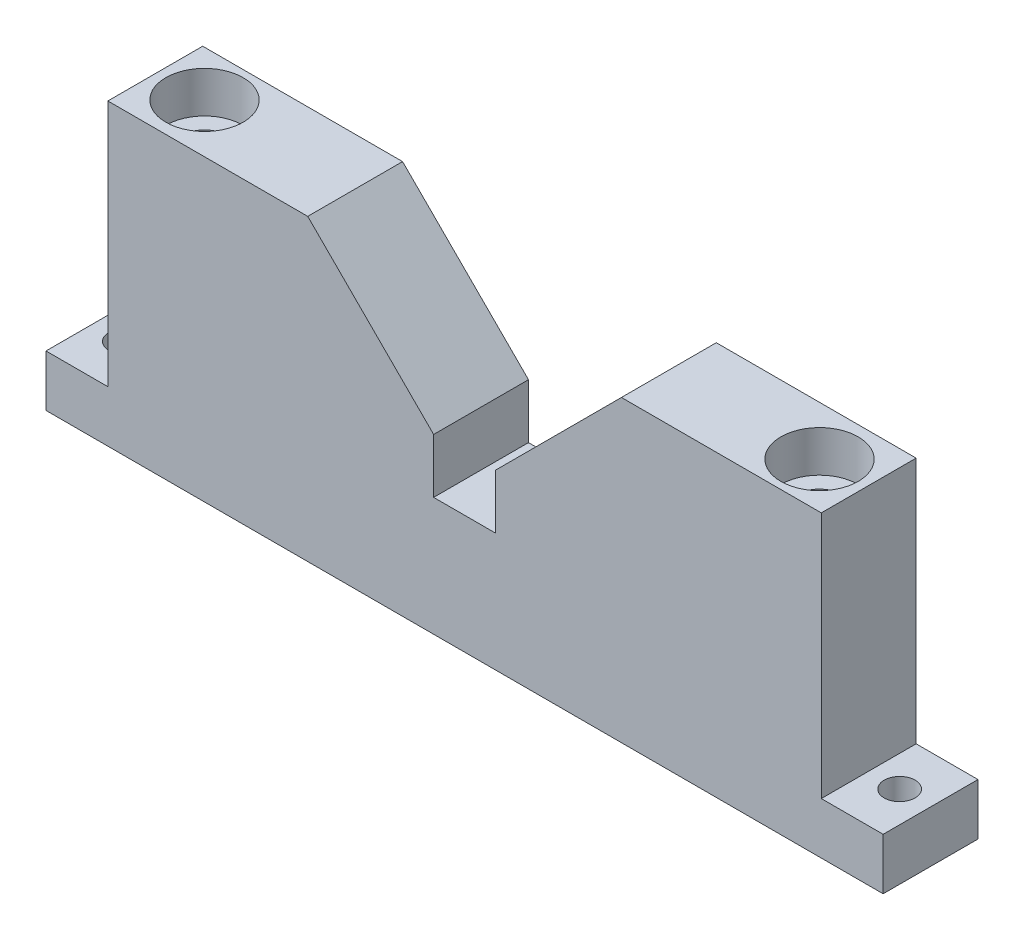
ISO-10303-21;
HEADER;
FILE_DESCRIPTION(('STEP AP214'),'2;1');
FILE_NAME('part.step','',(''),(''),'','','');
FILE_SCHEMA(('AUTOMOTIVE_DESIGN { 1 0 10303 214 1 1 1 1 }'));
ENDSEC;
DATA;
#1=APPLICATION_CONTEXT('core data for automotive mechanical design processes');
#2=APPLICATION_PROTOCOL_DEFINITION('international standard','automotive_design',2000,#1);
#3=PRODUCT_CONTEXT('',#1,'mechanical');
#4=PRODUCT('Part','Part','',(#3));
#5=PRODUCT_RELATED_PRODUCT_CATEGORY('part','',(#4));
#6=PRODUCT_DEFINITION_FORMATION('','',#4);
#7=PRODUCT_DEFINITION_CONTEXT('part definition',#1,'design');
#8=PRODUCT_DEFINITION('design','',#6,#7);
#9=PRODUCT_DEFINITION_SHAPE('','',#8);
#10=(LENGTH_UNIT() NAMED_UNIT(*) SI_UNIT(.MILLI.,.METRE.));
#11=(NAMED_UNIT(*) PLANE_ANGLE_UNIT() SI_UNIT($,.RADIAN.));
#12=(NAMED_UNIT(*) SI_UNIT($,.STERADIAN.) SOLID_ANGLE_UNIT());
#13=UNCERTAINTY_MEASURE_WITH_UNIT(LENGTH_MEASURE(1.E-05),#10,'distance_accuracy_value','');
#14=(GEOMETRIC_REPRESENTATION_CONTEXT(3) GLOBAL_UNCERTAINTY_ASSIGNED_CONTEXT((#13)) GLOBAL_UNIT_ASSIGNED_CONTEXT((#10,
#11,#12)) REPRESENTATION_CONTEXT('',''));
#15=CARTESIAN_POINT('',(0.,0.,0.));
#16=DIRECTION('',(0.,0.,1.));
#17=DIRECTION('',(1.,0.,0.));
#18=AXIS2_PLACEMENT_3D('',#15,#16,#17);
#19=CARTESIAN_POINT('',(-69.2,-60.,9.2));
#20=DIRECTION('',(1.,0.,0.));
#21=DIRECTION('',(0.,0.,-1.));
#22=AXIS2_PLACEMENT_3D('',#19,#20,#21);
#23=PLANE('',#22);
#24=DIRECTION('',(0.,-1.,0.));
#25=VECTOR('',#24,1.);
#26=CARTESIAN_POINT('',(-69.2,-60.,-9.2));
#27=LINE('',#26,#25);
#28=CARTESIAN_POINT('',(-69.2,-12.,-9.2));
#29=VERTEX_POINT('',#28);
#30=CARTESIAN_POINT('',(-69.2,-60.,-9.2));
#31=VERTEX_POINT('',#30);
#32=EDGE_CURVE('E180',#29,#31,#27,.T.);
#33=ORIENTED_EDGE('',*,*,#32,.T.);
#34=DIRECTION('',(0.,0.,-1.));
#35=VECTOR('',#34,1.);
#36=CARTESIAN_POINT('',(-69.2,-60.,9.2));
#37=LINE('',#36,#35);
#38=CARTESIAN_POINT('',(-69.2,-60.,9.2));
#39=VERTEX_POINT('',#38);
#40=EDGE_CURVE('E11',#39,#31,#37,.T.);
#41=ORIENTED_EDGE('',*,*,#40,.F.);
#42=DIRECTION('',(0.,-1.,0.));
#43=VECTOR('',#42,1.);
#44=CARTESIAN_POINT('',(-69.2,-60.,9.2));
#45=LINE('',#44,#43);
#46=CARTESIAN_POINT('',(-69.2,-12.,9.2));
#47=VERTEX_POINT('',#46);
#48=EDGE_CURVE('E93',#47,#39,#45,.T.);
#49=ORIENTED_EDGE('',*,*,#48,.F.);
#50=DIRECTION('',(0.,0.,-1.));
#51=VECTOR('',#50,1.);
#52=CARTESIAN_POINT('',(-69.2,-12.,9.2));
#53=LINE('',#52,#51);
#54=EDGE_CURVE('E136',#47,#29,#53,.T.);
#55=ORIENTED_EDGE('',*,*,#54,.T.);
#56=EDGE_LOOP('',(#33,#41,#49,#55));
#57=FACE_BOUND('',#56,.T.);
#58=ADVANCED_FACE('F30',(#57),#23,.F.);
#59=CARTESIAN_POINT('',(69.2,-12.,9.2));
#60=DIRECTION('',(-1.,0.,0.));
#61=DIRECTION('',(0.,0.,1.));
#62=AXIS2_PLACEMENT_3D('',#59,#60,#61);
#63=PLANE('',#62);
#64=DIRECTION('',(0.,1.,0.));
#65=VECTOR('',#64,1.);
#66=CARTESIAN_POINT('',(69.2,-12.,-9.2));
#67=LINE('',#66,#65);
#68=CARTESIAN_POINT('',(69.2,-60.,-9.2));
#69=VERTEX_POINT('',#68);
#70=CARTESIAN_POINT('',(69.2,-12.,-9.2));
#71=VERTEX_POINT('',#70);
#72=EDGE_CURVE('E143',#69,#71,#67,.T.);
#73=ORIENTED_EDGE('',*,*,#72,.T.);
#74=DIRECTION('',(0.,0.,-1.));
#75=VECTOR('',#74,1.);
#76=CARTESIAN_POINT('',(69.2,-12.,9.2));
#77=LINE('',#76,#75);
#78=CARTESIAN_POINT('',(69.2,-12.,9.2));
#79=VERTEX_POINT('',#78);
#80=EDGE_CURVE('E164',#79,#71,#77,.T.);
#81=ORIENTED_EDGE('',*,*,#80,.F.);
#82=DIRECTION('',(0.,1.,0.));
#83=VECTOR('',#82,1.);
#84=CARTESIAN_POINT('',(69.2,-12.,9.2));
#85=LINE('',#84,#83);
#86=CARTESIAN_POINT('',(69.2,-60.,9.2));
#87=VERTEX_POINT('',#86);
#88=EDGE_CURVE('E176',#87,#79,#85,.T.);
#89=ORIENTED_EDGE('',*,*,#88,.F.);
#90=DIRECTION('',(0.,0.,-1.));
#91=VECTOR('',#90,1.);
#92=CARTESIAN_POINT('',(69.2,-60.,9.2));
#93=LINE('',#92,#91);
#94=EDGE_CURVE('E39',#87,#69,#93,.T.);
#95=ORIENTED_EDGE('',*,*,#94,.T.);
#96=EDGE_LOOP('',(#73,#81,#89,#95));
#97=FACE_BOUND('',#96,.T.);
#98=ADVANCED_FACE('F241',(#97),#63,.F.);
#99=CARTESIAN_POINT('',(30.4264068711928,-12.,9.2));
#100=DIRECTION('',(0.,-1.,0.));
#101=DIRECTION('',(0.,0.,-1.));
#102=AXIS2_PLACEMENT_3D('',#99,#100,#101);
#103=PLANE('',#102);
#104=CARTESIAN_POINT('',(60.,-12.,0.343824935617583));
#105=DIRECTION('',(0.,1.,0.));
#106=DIRECTION('',(0.,0.,1.));
#107=AXIS2_PLACEMENT_3D('',#104,#105,#106);
#108=CIRCLE('',#107,7.5);
#109=CARTESIAN_POINT('',(60.,-12.,7.84382493561758));
#110=VERTEX_POINT('',#109);
#111=EDGE_CURVE('E298',#110,#110,#108,.T.);
#112=ORIENTED_EDGE('',*,*,#111,.F.);
#113=EDGE_LOOP('',(#112));
#114=FACE_BOUND('',#113,.T.);
#115=DIRECTION('',(-1.,0.,0.));
#116=VECTOR('',#115,1.);
#117=CARTESIAN_POINT('',(30.4264068711928,-12.,-9.2));
#118=LINE('',#117,#116);
#119=CARTESIAN_POINT('',(30.4264068711928,-12.,-9.2));
#120=VERTEX_POINT('',#119);
#121=EDGE_CURVE('E140',#71,#120,#118,.T.);
#122=ORIENTED_EDGE('',*,*,#121,.T.);
#123=DIRECTION('',(0.,0.,-1.));
#124=VECTOR('',#123,1.);
#125=CARTESIAN_POINT('',(30.4264068711928,-12.,9.2));
#126=LINE('',#125,#124);
#127=CARTESIAN_POINT('',(30.4264068711928,-12.,9.2));
#128=VERTEX_POINT('',#127);
#129=EDGE_CURVE('E161',#128,#120,#126,.T.);
#130=ORIENTED_EDGE('',*,*,#129,.F.);
#131=DIRECTION('',(-1.,0.,0.));
#132=VECTOR('',#131,1.);
#133=CARTESIAN_POINT('',(30.4264068711928,-12.,9.2));
#134=LINE('',#133,#132);
#135=EDGE_CURVE('E178',#79,#128,#134,.T.);
#136=ORIENTED_EDGE('',*,*,#135,.F.);
#137=ORIENTED_EDGE('',*,*,#80,.T.);
#138=EDGE_LOOP('',(#122,#130,#136,#137));
#139=FACE_BOUND('',#138,.T.);
#140=ADVANCED_FACE('F249',(#114,#139),#103,.F.);
#141=CARTESIAN_POINT('',(6.00000000000001,-36.4264068711929,9.2));
#142=DIRECTION('',(0.707106781186548,-0.707106781186547,0.));
#143=DIRECTION('',(0.707106781186547,0.707106781186548,0.));
#144=AXIS2_PLACEMENT_3D('',#141,#142,#143);
#145=PLANE('',#144);
#146=DIRECTION('',(-0.707106781186547,-0.707106781186548,0.));
#147=VECTOR('',#146,1.);
#148=CARTESIAN_POINT('',(6.00000000000001,-36.4264068711929,-9.2));
#149=LINE('',#148,#147);
#150=CARTESIAN_POINT('',(6.00000000000001,-36.4264068711929,-9.2));
#151=VERTEX_POINT('',#150);
#152=EDGE_CURVE('E142',#120,#151,#149,.T.);
#153=ORIENTED_EDGE('',*,*,#152,.T.);
#154=DIRECTION('',(0.,0.,-1.));
#155=VECTOR('',#154,1.);
#156=CARTESIAN_POINT('',(6.00000000000001,-36.4264068711929,9.2));
#157=LINE('',#156,#155);
#158=CARTESIAN_POINT('',(6.00000000000001,-36.4264068711929,9.2));
#159=VERTEX_POINT('',#158);
#160=EDGE_CURVE('E158',#159,#151,#157,.T.);
#161=ORIENTED_EDGE('',*,*,#160,.F.);
#162=DIRECTION('',(-0.707106781186547,-0.707106781186548,0.));
#163=VECTOR('',#162,1.);
#164=CARTESIAN_POINT('',(6.00000000000001,-36.4264068711929,9.2));
#165=LINE('',#164,#163);
#166=EDGE_CURVE('E255',#128,#159,#165,.T.);
#167=ORIENTED_EDGE('',*,*,#166,.F.);
#168=ORIENTED_EDGE('',*,*,#129,.T.);
#169=EDGE_LOOP('',(#153,#161,#167,#168));
#170=FACE_BOUND('',#169,.T.);
#171=ADVANCED_FACE('F253',(#170),#145,.F.);
#172=CARTESIAN_POINT('',(6.,-47.0000000000001,9.2));
#173=DIRECTION('',(1.,0.,0.));
#174=DIRECTION('',(0.,1.,0.));
#175=AXIS2_PLACEMENT_3D('',#172,#173,#174);
#176=PLANE('',#175);
#177=DIRECTION('',(0.,-1.,0.));
#178=VECTOR('',#177,1.);
#179=CARTESIAN_POINT('',(6.,-47.0000000000001,-9.2));
#180=LINE('',#179,#178);
#181=CARTESIAN_POINT('',(6.,-47.0000000000001,-9.2));
#182=VERTEX_POINT('',#181);
#183=EDGE_CURVE('E145',#151,#182,#180,.T.);
#184=ORIENTED_EDGE('',*,*,#183,.T.);
#185=DIRECTION('',(0.,0.,-1.));
#186=VECTOR('',#185,1.);
#187=CARTESIAN_POINT('',(6.,-47.0000000000001,9.2));
#188=LINE('',#187,#186);
#189=CARTESIAN_POINT('',(6.,-47.0000000000001,9.2));
#190=VERTEX_POINT('',#189);
#191=EDGE_CURVE('E155',#190,#182,#188,.T.);
#192=ORIENTED_EDGE('',*,*,#191,.F.);
#193=DIRECTION('',(0.,-1.,0.));
#194=VECTOR('',#193,1.);
#195=CARTESIAN_POINT('',(6.,-47.0000000000001,9.2));
#196=LINE('',#195,#194);
#197=EDGE_CURVE('E257',#159,#190,#196,.T.);
#198=ORIENTED_EDGE('',*,*,#197,.F.);
#199=ORIENTED_EDGE('',*,*,#160,.T.);
#200=EDGE_LOOP('',(#184,#192,#198,#199));
#201=FACE_BOUND('',#200,.T.);
#202=ADVANCED_FACE('F347',(#201),#176,.F.);
#203=CARTESIAN_POINT('',(-5.99999999999999,-47.0000000000001,9.2));
#204=DIRECTION('',(0.,-1.,0.));
#205=DIRECTION('',(1.,0.,0.));
#206=AXIS2_PLACEMENT_3D('',#203,#204,#205);
#207=PLANE('',#206);
#208=DIRECTION('',(-1.,0.,0.));
#209=VECTOR('',#208,1.);
#210=CARTESIAN_POINT('',(-5.99999999999999,-47.0000000000001,-9.2));
#211=LINE('',#210,#209);
#212=CARTESIAN_POINT('',(-5.99999999999999,-47.0000000000001,-9.2));
#213=VERTEX_POINT('',#212);
#214=EDGE_CURVE('E147',#182,#213,#211,.T.);
#215=ORIENTED_EDGE('',*,*,#214,.T.);
#216=DIRECTION('',(0.,0.,-1.));
#217=VECTOR('',#216,1.);
#218=CARTESIAN_POINT('',(-5.99999999999999,-47.0000000000001,9.2));
#219=LINE('',#218,#217);
#220=CARTESIAN_POINT('',(-5.99999999999999,-47.0000000000001,9.2));
#221=VERTEX_POINT('',#220);
#222=EDGE_CURVE('E131',#221,#213,#219,.T.);
#223=ORIENTED_EDGE('',*,*,#222,.F.);
#224=DIRECTION('',(-1.,0.,0.));
#225=VECTOR('',#224,1.);
#226=CARTESIAN_POINT('',(-5.99999999999999,-47.0000000000001,9.2));
#227=LINE('',#226,#225);
#228=EDGE_CURVE('E122',#190,#221,#227,.T.);
#229=ORIENTED_EDGE('',*,*,#228,.F.);
#230=ORIENTED_EDGE('',*,*,#191,.T.);
#231=EDGE_LOOP('',(#215,#223,#229,#230));
#232=FACE_BOUND('',#231,.T.);
#233=ADVANCED_FACE('F350',(#232),#207,.F.);
#234=CARTESIAN_POINT('',(-5.99999999999999,-36.4264068711928,9.2));
#235=DIRECTION('',(-1.,0.,0.));
#236=DIRECTION('',(0.,0.,1.));
#237=AXIS2_PLACEMENT_3D('',#234,#235,#236);
#238=PLANE('',#237);
#239=DIRECTION('',(0.,1.,0.));
#240=VECTOR('',#239,1.);
#241=CARTESIAN_POINT('',(-5.99999999999999,-36.4264068711928,-9.2));
#242=LINE('',#241,#240);
#243=CARTESIAN_POINT('',(-5.99999999999999,-36.4264068711928,-9.2));
#244=VERTEX_POINT('',#243);
#245=EDGE_CURVE('E130',#213,#244,#242,.T.);
#246=ORIENTED_EDGE('',*,*,#245,.T.);
#247=DIRECTION('',(0.,0.,-1.));
#248=VECTOR('',#247,1.);
#249=CARTESIAN_POINT('',(-5.99999999999999,-36.4264068711928,9.2));
#250=LINE('',#249,#248);
#251=CARTESIAN_POINT('',(-5.99999999999999,-36.4264068711928,9.2));
#252=VERTEX_POINT('',#251);
#253=EDGE_CURVE('E127',#252,#244,#250,.T.);
#254=ORIENTED_EDGE('',*,*,#253,.F.);
#255=DIRECTION('',(0.,1.,0.));
#256=VECTOR('',#255,1.);
#257=CARTESIAN_POINT('',(-5.99999999999999,-36.4264068711928,9.2));
#258=LINE('',#257,#256);
#259=EDGE_CURVE('E116',#221,#252,#258,.T.);
#260=ORIENTED_EDGE('',*,*,#259,.F.);
#261=ORIENTED_EDGE('',*,*,#222,.T.);
#262=EDGE_LOOP('',(#246,#254,#260,#261));
#263=FACE_BOUND('',#262,.T.);
#264=ADVANCED_FACE('F128',(#263),#238,.F.);
#265=CARTESIAN_POINT('',(-30.4264068711928,-12.,9.2));
#266=DIRECTION('',(-0.707106781186547,-0.707106781186548,0.));
#267=DIRECTION('',(0.707106781186548,-0.707106781186547,0.));
#268=AXIS2_PLACEMENT_3D('',#265,#266,#267);
#269=PLANE('',#268);
#270=DIRECTION('',(-0.707106781186548,0.707106781186547,0.));
#271=VECTOR('',#270,1.);
#272=CARTESIAN_POINT('',(-30.4264068711928,-12.,-9.2));
#273=LINE('',#272,#271);
#274=CARTESIAN_POINT('',(-30.4264068711928,-12.,-9.2));
#275=VERTEX_POINT('',#274);
#276=EDGE_CURVE('E81',#244,#275,#273,.T.);
#277=ORIENTED_EDGE('',*,*,#276,.T.);
#278=DIRECTION('',(0.,0.,-1.));
#279=VECTOR('',#278,1.);
#280=CARTESIAN_POINT('',(-30.4264068711928,-12.,9.2));
#281=LINE('',#280,#279);
#282=CARTESIAN_POINT('',(-30.4264068711928,-12.,9.2));
#283=VERTEX_POINT('',#282);
#284=EDGE_CURVE('E132',#283,#275,#281,.T.);
#285=ORIENTED_EDGE('',*,*,#284,.F.);
#286=DIRECTION('',(-0.707106781186548,0.707106781186547,0.));
#287=VECTOR('',#286,1.);
#288=CARTESIAN_POINT('',(-30.4264068711928,-12.,9.2));
#289=LINE('',#288,#287);
#290=EDGE_CURVE('E120',#252,#283,#289,.T.);
#291=ORIENTED_EDGE('',*,*,#290,.F.);
#292=ORIENTED_EDGE('',*,*,#253,.T.);
#293=EDGE_LOOP('',(#277,#285,#291,#292));
#294=FACE_BOUND('',#293,.T.);
#295=ADVANCED_FACE('F134',(#294),#269,.F.);
#296=CARTESIAN_POINT('',(-69.2,-12.,9.2));
#297=DIRECTION('',(0.,-1.,0.));
#298=DIRECTION('',(0.,0.,-1.));
#299=AXIS2_PLACEMENT_3D('',#296,#297,#298);
#300=PLANE('',#299);
#301=CARTESIAN_POINT('',(-60.,-12.,-0.343824935617591));
#302=DIRECTION('',(0.,1.,0.));
#303=DIRECTION('',(0.,0.,1.));
#304=AXIS2_PLACEMENT_3D('',#301,#302,#303);
#305=CIRCLE('',#304,7.49999999999999);
#306=CARTESIAN_POINT('',(-60.,-12.,7.1561750643824));
#307=VERTEX_POINT('',#306);
#308=EDGE_CURVE('E286',#307,#307,#305,.T.);
#309=ORIENTED_EDGE('',*,*,#308,.F.);
#310=EDGE_LOOP('',(#309));
#311=FACE_BOUND('',#310,.T.);
#312=DIRECTION('',(-1.,0.,0.));
#313=VECTOR('',#312,1.);
#314=CARTESIAN_POINT('',(-69.2,-12.,-9.2));
#315=LINE('',#314,#313);
#316=EDGE_CURVE('E87',#275,#29,#315,.T.);
#317=ORIENTED_EDGE('',*,*,#316,.T.);
#318=ORIENTED_EDGE('',*,*,#54,.F.);
#319=DIRECTION('',(-1.,0.,0.));
#320=VECTOR('',#319,1.);
#321=CARTESIAN_POINT('',(-69.2,-12.,9.2));
#322=LINE('',#321,#320);
#323=EDGE_CURVE('E48',#283,#47,#322,.T.);
#324=ORIENTED_EDGE('',*,*,#323,.F.);
#325=ORIENTED_EDGE('',*,*,#284,.T.);
#326=EDGE_LOOP('',(#317,#318,#324,#325));
#327=FACE_BOUND('',#326,.T.);
#328=ADVANCED_FACE('F359',(#311,#327),#300,.F.);
#329=CARTESIAN_POINT('',(-69.2,-12.,9.2));
#330=DIRECTION('',(0.,0.,-1.));
#331=DIRECTION('',(-1.,0.,0.));
#332=AXIS2_PLACEMENT_3D('',#329,#330,#331);
#333=PLANE('',#332);
#334=ORIENTED_EDGE('',*,*,#48,.T.);
#335=DIRECTION('',(-1.,0.,0.));
#336=VECTOR('',#335,1.);
#337=CARTESIAN_POINT('',(-81.2,-60.,9.2));
#338=LINE('',#337,#336);
#339=CARTESIAN_POINT('',(-81.2,-60.,9.2));
#340=VERTEX_POINT('',#339);
#341=EDGE_CURVE('E209',#39,#340,#338,.T.);
#342=ORIENTED_EDGE('',*,*,#341,.T.);
#343=DIRECTION('',(0.,1.,0.));
#344=VECTOR('',#343,1.);
#345=CARTESIAN_POINT('',(-81.2,-70.,9.2));
#346=LINE('',#345,#344);
#347=CARTESIAN_POINT('',(-81.2,-70.,9.2));
#348=VERTEX_POINT('',#347);
#349=EDGE_CURVE('E216',#348,#340,#346,.T.);
#350=ORIENTED_EDGE('',*,*,#349,.F.);
#351=DIRECTION('',(-1.,0.,0.));
#352=VECTOR('',#351,1.);
#353=CARTESIAN_POINT('',(-81.2,-70.,9.2));
#354=LINE('',#353,#352);
#355=CARTESIAN_POINT('',(81.2,-70.,9.2));
#356=VERTEX_POINT('',#355);
#357=EDGE_CURVE('E219',#356,#348,#354,.T.);
#358=ORIENTED_EDGE('',*,*,#357,.F.);
#359=DIRECTION('',(0.,1.,0.));
#360=VECTOR('',#359,1.);
#361=CARTESIAN_POINT('',(81.2,-70.,9.2));
#362=LINE('',#361,#360);
#363=CARTESIAN_POINT('',(81.2,-60.,9.2));
#364=VERTEX_POINT('',#363);
#365=EDGE_CURVE('E200',#356,#364,#362,.T.);
#366=ORIENTED_EDGE('',*,*,#365,.T.);
#367=EDGE_CURVE('E204',#364,#87,#338,.T.);
#368=ORIENTED_EDGE('',*,*,#367,.T.);
#369=ORIENTED_EDGE('',*,*,#88,.T.);
#370=ORIENTED_EDGE('',*,*,#135,.T.);
#371=ORIENTED_EDGE('',*,*,#166,.T.);
#372=ORIENTED_EDGE('',*,*,#197,.T.);
#373=ORIENTED_EDGE('',*,*,#228,.T.);
#374=ORIENTED_EDGE('',*,*,#259,.T.);
#375=ORIENTED_EDGE('',*,*,#290,.T.);
#376=ORIENTED_EDGE('',*,*,#323,.T.);
#377=EDGE_LOOP('',(#334,#342,#350,#358,#366,#368,#369,#370,#371,#372,#373,#374,#375,#376));
#378=FACE_BOUND('',#377,.T.);
#379=ADVANCED_FACE('F118',(#378),#333,.F.);
#380=CARTESIAN_POINT('',(-69.2,-12.,-9.2));
#381=DIRECTION('',(0.,0.,-1.));
#382=DIRECTION('',(-1.,0.,0.));
#383=AXIS2_PLACEMENT_3D('',#380,#381,#382);
#384=PLANE('',#383);
#385=ORIENTED_EDGE('',*,*,#32,.F.);
#386=ORIENTED_EDGE('',*,*,#316,.F.);
#387=ORIENTED_EDGE('',*,*,#276,.F.);
#388=ORIENTED_EDGE('',*,*,#245,.F.);
#389=ORIENTED_EDGE('',*,*,#214,.F.);
#390=ORIENTED_EDGE('',*,*,#183,.F.);
#391=ORIENTED_EDGE('',*,*,#152,.F.);
#392=ORIENTED_EDGE('',*,*,#121,.F.);
#393=ORIENTED_EDGE('',*,*,#72,.F.);
#394=DIRECTION('',(1.,0.,0.));
#395=VECTOR('',#394,1.);
#396=CARTESIAN_POINT('',(-81.2,-60.,-9.2));
#397=LINE('',#396,#395);
#398=CARTESIAN_POINT('',(81.2,-60.,-9.2));
#399=VERTEX_POINT('',#398);
#400=EDGE_CURVE('E240',#69,#399,#397,.T.);
#401=ORIENTED_EDGE('',*,*,#400,.T.);
#402=DIRECTION('',(0.,1.,0.));
#403=VECTOR('',#402,1.);
#404=CARTESIAN_POINT('',(81.2,-70.,-9.2));
#405=LINE('',#404,#403);
#406=CARTESIAN_POINT('',(81.2,-70.,-9.2));
#407=VERTEX_POINT('',#406);
#408=EDGE_CURVE('E189',#407,#399,#405,.T.);
#409=ORIENTED_EDGE('',*,*,#408,.F.);
#410=DIRECTION('',(1.,0.,0.));
#411=VECTOR('',#410,1.);
#412=CARTESIAN_POINT('',(-81.2,-70.,-9.2));
#413=LINE('',#412,#411);
#414=CARTESIAN_POINT('',(-81.2,-70.,-9.2));
#415=VERTEX_POINT('',#414);
#416=EDGE_CURVE('E273',#415,#407,#413,.T.);
#417=ORIENTED_EDGE('',*,*,#416,.F.);
#418=DIRECTION('',(0.,1.,0.));
#419=VECTOR('',#418,1.);
#420=CARTESIAN_POINT('',(-81.2,-70.,-9.2));
#421=LINE('',#420,#419);
#422=CARTESIAN_POINT('',(-81.2,-60.,-9.2));
#423=VERTEX_POINT('',#422);
#424=EDGE_CURVE('E185',#415,#423,#421,.T.);
#425=ORIENTED_EDGE('',*,*,#424,.T.);
#426=EDGE_CURVE('E262',#423,#31,#397,.T.);
#427=ORIENTED_EDGE('',*,*,#426,.T.);
#428=EDGE_LOOP('',(#385,#386,#387,#388,#389,#390,#391,#392,#393,#401,#409,#417,#425,#427));
#429=FACE_BOUND('',#428,.T.);
#430=ADVANCED_FACE('F243',(#429),#384,.T.);
#431=CARTESIAN_POINT('',(-81.2,-60.,-9.2));
#432=DIRECTION('',(0.,-1.,0.));
#433=DIRECTION('',(0.,0.,-1.));
#434=AXIS2_PLACEMENT_3D('',#431,#432,#433);
#435=PLANE('',#434);
#436=CARTESIAN_POINT('',(-75.2,-60.,0.));
#437=DIRECTION('',(0.,1.,0.));
#438=DIRECTION('',(0.,0.,1.));
#439=AXIS2_PLACEMENT_3D('',#436,#437,#438);
#440=CIRCLE('',#439,2.99999999999999);
#441=CARTESIAN_POINT('',(-75.2,-60.,2.99999999999999));
#442=VERTEX_POINT('',#441);
#443=EDGE_CURVE('E304',#442,#442,#440,.T.);
#444=ORIENTED_EDGE('',*,*,#443,.F.);
#445=EDGE_LOOP('',(#444));
#446=FACE_BOUND('',#445,.T.);
#447=ORIENTED_EDGE('',*,*,#341,.F.);
#448=ORIENTED_EDGE('',*,*,#40,.T.);
#449=ORIENTED_EDGE('',*,*,#426,.F.);
#450=DIRECTION('',(0.,0.,-1.));
#451=VECTOR('',#450,1.);
#452=CARTESIAN_POINT('',(-81.2,-60.,9.2));
#453=LINE('',#452,#451);
#454=EDGE_CURVE('E263',#340,#423,#453,.T.);
#455=ORIENTED_EDGE('',*,*,#454,.F.);
#456=EDGE_LOOP('',(#447,#448,#449,#455));
#457=FACE_BOUND('',#456,.T.);
#458=ADVANCED_FACE('F320',(#446,#457),#435,.F.);
#459=CARTESIAN_POINT('',(-81.2,-70.,9.2));
#460=DIRECTION('',(1.,0.,0.));
#461=DIRECTION('',(0.,0.,-1.));
#462=AXIS2_PLACEMENT_3D('',#459,#460,#461);
#463=PLANE('',#462);
#464=ORIENTED_EDGE('',*,*,#454,.T.);
#465=ORIENTED_EDGE('',*,*,#424,.F.);
#466=DIRECTION('',(0.,0.,-1.));
#467=VECTOR('',#466,1.);
#468=CARTESIAN_POINT('',(-81.2,-70.,9.2));
#469=LINE('',#468,#467);
#470=EDGE_CURVE('E208',#348,#415,#469,.T.);
#471=ORIENTED_EDGE('',*,*,#470,.F.);
#472=ORIENTED_EDGE('',*,*,#349,.T.);
#473=EDGE_LOOP('',(#464,#465,#471,#472));
#474=FACE_BOUND('',#473,.T.);
#475=ADVANCED_FACE('F333',(#474),#463,.F.);
#476=CARTESIAN_POINT('',(81.2,-70.,9.2));
#477=DIRECTION('',(-1.,0.,0.));
#478=DIRECTION('',(0.,0.,1.));
#479=AXIS2_PLACEMENT_3D('',#476,#477,#478);
#480=PLANE('',#479);
#481=DIRECTION('',(0.,0.,1.));
#482=VECTOR('',#481,1.);
#483=CARTESIAN_POINT('',(81.2,-60.,9.2));
#484=LINE('',#483,#482);
#485=EDGE_CURVE('E214',#399,#364,#484,.T.);
#486=ORIENTED_EDGE('',*,*,#485,.T.);
#487=ORIENTED_EDGE('',*,*,#365,.F.);
#488=DIRECTION('',(0.,0.,1.));
#489=VECTOR('',#488,1.);
#490=CARTESIAN_POINT('',(81.2,-70.,9.2));
#491=LINE('',#490,#489);
#492=EDGE_CURVE('E270',#407,#356,#491,.T.);
#493=ORIENTED_EDGE('',*,*,#492,.F.);
#494=ORIENTED_EDGE('',*,*,#408,.T.);
#495=EDGE_LOOP('',(#486,#487,#493,#494));
#496=FACE_BOUND('',#495,.T.);
#497=ADVANCED_FACE('F328',(#496),#480,.F.);
#498=CARTESIAN_POINT('',(-81.2,-70.,-9.2));
#499=DIRECTION('',(0.,-1.,0.));
#500=DIRECTION('',(0.,0.,-1.));
#501=AXIS2_PLACEMENT_3D('',#498,#499,#500);
#502=PLANE('',#501);
#503=CARTESIAN_POINT('',(75.2,-70.,0.));
#504=DIRECTION('',(0.,1.,0.));
#505=DIRECTION('',(0.,0.,1.));
#506=AXIS2_PLACEMENT_3D('',#503,#504,#505);
#507=CIRCLE('',#506,3.);
#508=CARTESIAN_POINT('',(75.2,-70.,3.));
#509=VERTEX_POINT('',#508);
#510=EDGE_CURVE('E307',#509,#509,#507,.T.);
#511=ORIENTED_EDGE('',*,*,#510,.T.);
#512=EDGE_LOOP('',(#511));
#513=FACE_BOUND('',#512,.T.);
#514=CARTESIAN_POINT('',(-75.2,-70.,0.));
#515=DIRECTION('',(0.,1.,0.));
#516=DIRECTION('',(0.,0.,1.));
#517=AXIS2_PLACEMENT_3D('',#514,#515,#516);
#518=CIRCLE('',#517,3.);
#519=CARTESIAN_POINT('',(-75.2,-70.,3.));
#520=VERTEX_POINT('',#519);
#521=EDGE_CURVE('E301',#520,#520,#518,.T.);
#522=ORIENTED_EDGE('',*,*,#521,.T.);
#523=EDGE_LOOP('',(#522));
#524=FACE_BOUND('',#523,.T.);
#525=CARTESIAN_POINT('',(60.,-70.,0.343824935617583));
#526=DIRECTION('',(0.,1.,0.));
#527=DIRECTION('',(0.,0.,1.));
#528=AXIS2_PLACEMENT_3D('',#525,#526,#527);
#529=CIRCLE('',#528,4.19999999999999);
#530=CARTESIAN_POINT('',(60.,-70.,4.54382493561757));
#531=VERTEX_POINT('',#530);
#532=EDGE_CURVE('E289',#531,#531,#529,.T.);
#533=ORIENTED_EDGE('',*,*,#532,.T.);
#534=EDGE_LOOP('',(#533));
#535=FACE_BOUND('',#534,.T.);
#536=CARTESIAN_POINT('',(-60.,-70.,-0.343824935617591));
#537=DIRECTION('',(0.,1.,0.));
#538=DIRECTION('',(0.,0.,1.));
#539=AXIS2_PLACEMENT_3D('',#536,#537,#538);
#540=CIRCLE('',#539,4.19999999999998);
#541=CARTESIAN_POINT('',(-60.,-70.,3.85617506438239));
#542=VERTEX_POINT('',#541);
#543=EDGE_CURVE('E268',#542,#542,#540,.T.);
#544=ORIENTED_EDGE('',*,*,#543,.T.);
#545=EDGE_LOOP('',(#544));
#546=FACE_BOUND('',#545,.T.);
#547=ORIENTED_EDGE('',*,*,#470,.T.);
#548=ORIENTED_EDGE('',*,*,#416,.T.);
#549=ORIENTED_EDGE('',*,*,#492,.T.);
#550=ORIENTED_EDGE('',*,*,#357,.T.);
#551=EDGE_LOOP('',(#547,#548,#549,#550));
#552=FACE_BOUND('',#551,.T.);
#553=ADVANCED_FACE('F318',(#513,#524,#535,#546,#552),#502,.T.);
#554=CARTESIAN_POINT('',(75.2,-60.,0.));
#555=DIRECTION('',(0.,1.,0.));
#556=DIRECTION('',(0.,0.,1.));
#557=AXIS2_PLACEMENT_3D('',#554,#555,#556);
#558=CIRCLE('',#557,2.99999999999999);
#559=CARTESIAN_POINT('',(75.2,-60.,2.99999999999999));
#560=VERTEX_POINT('',#559);
#561=EDGE_CURVE('E310',#560,#560,#558,.T.);
#562=ORIENTED_EDGE('',*,*,#561,.F.);
#563=EDGE_LOOP('',(#562));
#564=FACE_BOUND('',#563,.T.);
#565=ORIENTED_EDGE('',*,*,#94,.F.);
#566=ORIENTED_EDGE('',*,*,#367,.F.);
#567=ORIENTED_EDGE('',*,*,#485,.F.);
#568=ORIENTED_EDGE('',*,*,#400,.F.);
#569=EDGE_LOOP('',(#565,#566,#567,#568));
#570=FACE_BOUND('',#569,.T.);
#571=ADVANCED_FACE('F237',(#564,#570),#435,.F.);
#572=CARTESIAN_POINT('',(-60.,-12.,-0.343824935617591));
#573=DIRECTION('',(0.,1.,0.));
#574=DIRECTION('',(0.,0.,1.));
#575=AXIS2_PLACEMENT_3D('',#572,#573,#574);
#576=CYLINDRICAL_SURFACE('',#575,4.2);
#577=ORIENTED_EDGE('',*,*,#543,.F.);
#578=EDGE_LOOP('',(#577));
#579=FACE_BOUND('',#578,.T.);
#580=CARTESIAN_POINT('',(-60.,-20.,-0.343824935617591));
#581=DIRECTION('',(0.,1.,0.));
#582=DIRECTION('',(0.,0.,1.));
#583=AXIS2_PLACEMENT_3D('',#580,#581,#582);
#584=CIRCLE('',#583,4.20000000000001);
#585=CARTESIAN_POINT('',(-60.,-20.,3.85617506438242));
#586=VERTEX_POINT('',#585);
#587=EDGE_CURVE('E280',#586,#586,#584,.T.);
#588=ORIENTED_EDGE('',*,*,#587,.T.);
#589=EDGE_LOOP('',(#588));
#590=FACE_BOUND('',#589,.T.);
#591=ADVANCED_FACE('F317',(#579,#590),#576,.F.);
#592=CARTESIAN_POINT('',(-55.8,-20.,-0.343824935617591));
#593=DIRECTION('',(0.,-1.,0.));
#594=DIRECTION('',(0.,0.,-1.));
#595=AXIS2_PLACEMENT_3D('',#592,#593,#594);
#596=PLANE('',#595);
#597=ORIENTED_EDGE('',*,*,#587,.F.);
#598=EDGE_LOOP('',(#597));
#599=FACE_BOUND('',#598,.T.);
#600=CARTESIAN_POINT('',(-60.,-20.,-0.343824935617591));
#601=DIRECTION('',(0.,1.,0.));
#602=DIRECTION('',(0.,0.,1.));
#603=AXIS2_PLACEMENT_3D('',#600,#601,#602);
#604=CIRCLE('',#603,7.5);
#605=CARTESIAN_POINT('',(-60.,-20.,7.15617506438241));
#606=VERTEX_POINT('',#605);
#607=EDGE_CURVE('E283',#606,#606,#604,.T.);
#608=ORIENTED_EDGE('',*,*,#607,.T.);
#609=EDGE_LOOP('',(#608));
#610=FACE_BOUND('',#609,.T.);
#611=ADVANCED_FACE('F325',(#599,#610),#596,.F.);
#612=CARTESIAN_POINT('',(-60.,-12.,-0.343824935617591));
#613=DIRECTION('',(0.,1.,0.));
#614=DIRECTION('',(0.,0.,1.));
#615=AXIS2_PLACEMENT_3D('',#612,#613,#614);
#616=CYLINDRICAL_SURFACE('',#615,7.5);
#617=ORIENTED_EDGE('',*,*,#607,.F.);
#618=EDGE_LOOP('',(#617));
#619=FACE_BOUND('',#618,.T.);
#620=ORIENTED_EDGE('',*,*,#308,.T.);
#621=EDGE_LOOP('',(#620));
#622=FACE_BOUND('',#621,.T.);
#623=ADVANCED_FACE('F442',(#619,#622),#616,.F.);
#624=CARTESIAN_POINT('',(60.,-12.,0.343824935617583));
#625=DIRECTION('',(0.,1.,0.));
#626=DIRECTION('',(0.,0.,1.));
#627=AXIS2_PLACEMENT_3D('',#624,#625,#626);
#628=CYLINDRICAL_SURFACE('',#627,4.2);
#629=ORIENTED_EDGE('',*,*,#532,.F.);
#630=EDGE_LOOP('',(#629));
#631=FACE_BOUND('',#630,.T.);
#632=CARTESIAN_POINT('',(60.,-20.,0.343824935617583));
#633=DIRECTION('',(0.,1.,0.));
#634=DIRECTION('',(0.,0.,1.));
#635=AXIS2_PLACEMENT_3D('',#632,#633,#634);
#636=CIRCLE('',#635,4.20000000000002);
#637=CARTESIAN_POINT('',(60.,-20.,4.5438249356176));
#638=VERTEX_POINT('',#637);
#639=EDGE_CURVE('E292',#638,#638,#636,.T.);
#640=ORIENTED_EDGE('',*,*,#639,.T.);
#641=EDGE_LOOP('',(#640));
#642=FACE_BOUND('',#641,.T.);
#643=ADVANCED_FACE('F438',(#631,#642),#628,.F.);
#644=CARTESIAN_POINT('',(64.2,-20.,0.343824935617583));
#645=DIRECTION('',(0.,-1.,0.));
#646=DIRECTION('',(0.,0.,-1.));
#647=AXIS2_PLACEMENT_3D('',#644,#645,#646);
#648=PLANE('',#647);
#649=ORIENTED_EDGE('',*,*,#639,.F.);
#650=EDGE_LOOP('',(#649));
#651=FACE_BOUND('',#650,.T.);
#652=CARTESIAN_POINT('',(60.,-20.,0.343824935617583));
#653=DIRECTION('',(0.,1.,0.));
#654=DIRECTION('',(0.,0.,1.));
#655=AXIS2_PLACEMENT_3D('',#652,#653,#654);
#656=CIRCLE('',#655,7.5);
#657=CARTESIAN_POINT('',(60.,-20.,7.84382493561758));
#658=VERTEX_POINT('',#657);
#659=EDGE_CURVE('E295',#658,#658,#656,.T.);
#660=ORIENTED_EDGE('',*,*,#659,.T.);
#661=EDGE_LOOP('',(#660));
#662=FACE_BOUND('',#661,.T.);
#663=ADVANCED_FACE('F434',(#651,#662),#648,.F.);
#664=CARTESIAN_POINT('',(60.,-12.,0.343824935617583));
#665=DIRECTION('',(0.,1.,0.));
#666=DIRECTION('',(0.,0.,1.));
#667=AXIS2_PLACEMENT_3D('',#664,#665,#666);
#668=CYLINDRICAL_SURFACE('',#667,7.5);
#669=ORIENTED_EDGE('',*,*,#659,.F.);
#670=EDGE_LOOP('',(#669));
#671=FACE_BOUND('',#670,.T.);
#672=ORIENTED_EDGE('',*,*,#111,.T.);
#673=EDGE_LOOP('',(#672));
#674=FACE_BOUND('',#673,.T.);
#675=ADVANCED_FACE('F415',(#671,#674),#668,.F.);
#676=CARTESIAN_POINT('',(-75.2,-60.,0.));
#677=DIRECTION('',(0.,1.,0.));
#678=DIRECTION('',(0.,0.,1.));
#679=AXIS2_PLACEMENT_3D('',#676,#677,#678);
#680=CYLINDRICAL_SURFACE('',#679,3.);
#681=ORIENTED_EDGE('',*,*,#521,.F.);
#682=EDGE_LOOP('',(#681));
#683=FACE_BOUND('',#682,.T.);
#684=ORIENTED_EDGE('',*,*,#443,.T.);
#685=EDGE_LOOP('',(#684));
#686=FACE_BOUND('',#685,.T.);
#687=ADVANCED_FACE('F410',(#683,#686),#680,.F.);
#688=CARTESIAN_POINT('',(75.2,-60.,0.));
#689=DIRECTION('',(0.,1.,0.));
#690=DIRECTION('',(0.,0.,1.));
#691=AXIS2_PLACEMENT_3D('',#688,#689,#690);
#692=CYLINDRICAL_SURFACE('',#691,3.);
#693=ORIENTED_EDGE('',*,*,#510,.F.);
#694=EDGE_LOOP('',(#693));
#695=FACE_BOUND('',#694,.T.);
#696=ORIENTED_EDGE('',*,*,#561,.T.);
#697=EDGE_LOOP('',(#696));
#698=FACE_BOUND('',#697,.T.);
#699=ADVANCED_FACE('F314',(#695,#698),#692,.F.);
#700=CLOSED_SHELL('',(#58,#98,#140,#171,#202,#233,#264,#295,#328,#379,#430,#458,#475,#497,#553,
#571,#591,#611,#623,#643,#663,#675,#687,#699));
#701=MANIFOLD_SOLID_BREP('B2',#700);
#702=ADVANCED_BREP_SHAPE_REPRESENTATION('',(#18,#701),#14);
#703=SHAPE_DEFINITION_REPRESENTATION(#9,#702);
ENDSEC;
END-ISO-10303-21;
